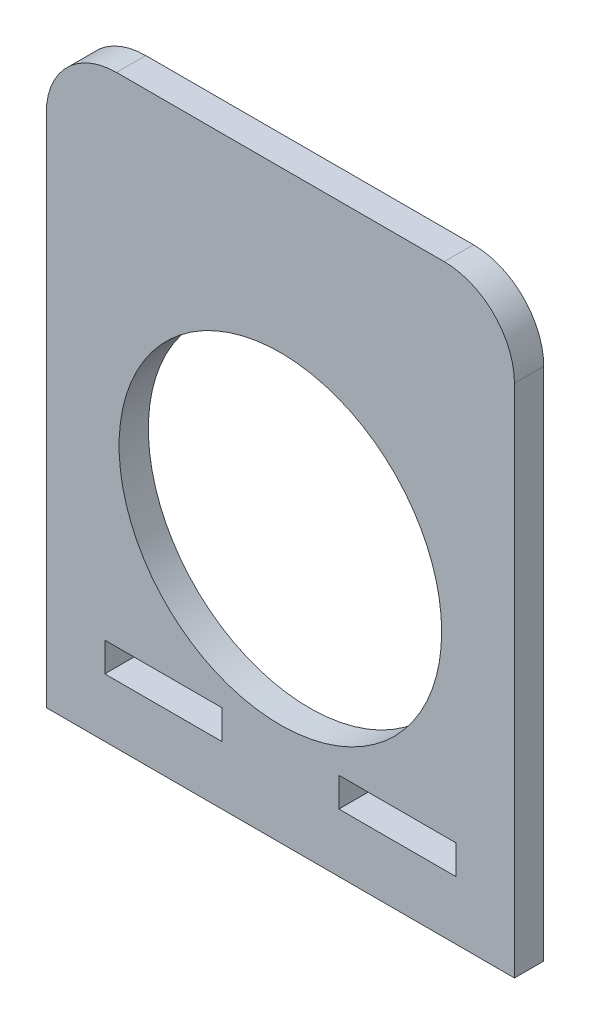
ISO-10303-21;
HEADER;
FILE_DESCRIPTION(('STEP AP214'),'2;1');
FILE_NAME('part.step','',(''),(''),'','','');
FILE_SCHEMA(('AUTOMOTIVE_DESIGN { 1 0 10303 214 1 1 1 1 }'));
ENDSEC;
DATA;
#1=APPLICATION_CONTEXT('core data for automotive mechanical design processes');
#2=APPLICATION_PROTOCOL_DEFINITION('international standard','automotive_design',2000,#1);
#3=PRODUCT_CONTEXT('',#1,'mechanical');
#4=PRODUCT('Part','Part','',(#3));
#5=PRODUCT_RELATED_PRODUCT_CATEGORY('part','',(#4));
#6=PRODUCT_DEFINITION_FORMATION('','',#4);
#7=PRODUCT_DEFINITION_CONTEXT('part definition',#1,'design');
#8=PRODUCT_DEFINITION('design','',#6,#7);
#9=PRODUCT_DEFINITION_SHAPE('','',#8);
#10=(LENGTH_UNIT() NAMED_UNIT(*) SI_UNIT(.MILLI.,.METRE.));
#11=(NAMED_UNIT(*) PLANE_ANGLE_UNIT() SI_UNIT($,.RADIAN.));
#12=(NAMED_UNIT(*) SI_UNIT($,.STERADIAN.) SOLID_ANGLE_UNIT());
#13=UNCERTAINTY_MEASURE_WITH_UNIT(LENGTH_MEASURE(1.E-05),#10,'distance_accuracy_value','');
#14=(GEOMETRIC_REPRESENTATION_CONTEXT(3) GLOBAL_UNCERTAINTY_ASSIGNED_CONTEXT((#13)) GLOBAL_UNIT_ASSIGNED_CONTEXT((#10,
#11,#12)) REPRESENTATION_CONTEXT('',''));
#15=CARTESIAN_POINT('',(0.,0.,0.));
#16=DIRECTION('',(0.,0.,1.));
#17=DIRECTION('',(1.,0.,0.));
#18=AXIS2_PLACEMENT_3D('',#15,#16,#17);
#19=CARTESIAN_POINT('',(43.18,55.88,3.175));
#20=DIRECTION('',(0.,0.,1.));
#21=DIRECTION('',(1.,0.,0.));
#22=AXIS2_PLACEMENT_3D('',#19,#20,#21);
#23=PLANE('',#22);
#24=DIRECTION('',(1.,0.,0.));
#25=VECTOR('',#24,1.);
#26=CARTESIAN_POINT('',(6.35,6.35,3.175));
#27=LINE('',#26,#25);
#28=CARTESIAN_POINT('',(6.35,6.35,3.175));
#29=VERTEX_POINT('',#28);
#30=CARTESIAN_POINT('',(19.05,6.35,3.175));
#31=VERTEX_POINT('',#30);
#32=EDGE_CURVE('E178',#29,#31,#27,.T.);
#33=ORIENTED_EDGE('',*,*,#32,.F.);
#34=DIRECTION('',(0.,-1.,0.));
#35=VECTOR('',#34,1.);
#36=CARTESIAN_POINT('',(6.35,6.35,3.175));
#37=LINE('',#36,#35);
#38=CARTESIAN_POINT('',(6.35,9.52499999999999,3.175));
#39=VERTEX_POINT('',#38);
#40=EDGE_CURVE('E176',#39,#29,#37,.T.);
#41=ORIENTED_EDGE('',*,*,#40,.F.);
#42=DIRECTION('',(-1.,0.,0.));
#43=VECTOR('',#42,1.);
#44=CARTESIAN_POINT('',(6.35,9.52499999999999,3.175));
#45=LINE('',#44,#43);
#46=CARTESIAN_POINT('',(19.05,9.525,3.175));
#47=VERTEX_POINT('',#46);
#48=EDGE_CURVE('E184',#47,#39,#45,.T.);
#49=ORIENTED_EDGE('',*,*,#48,.F.);
#50=DIRECTION('',(0.,1.,0.));
#51=VECTOR('',#50,1.);
#52=CARTESIAN_POINT('',(19.05,6.35,3.175));
#53=LINE('',#52,#51);
#54=EDGE_CURVE('E181',#31,#47,#53,.T.);
#55=ORIENTED_EDGE('',*,*,#54,.F.);
#56=EDGE_LOOP('',(#33,#41,#49,#55));
#57=FACE_BOUND('',#56,.T.);
#58=DIRECTION('',(0.,1.,0.));
#59=VECTOR('',#58,1.);
#60=CARTESIAN_POINT('',(50.8,0.,3.175));
#61=LINE('',#60,#59);
#62=CARTESIAN_POINT('',(50.8,0.,3.175));
#63=VERTEX_POINT('',#62);
#64=CARTESIAN_POINT('',(50.8,55.88,3.175));
#65=VERTEX_POINT('',#64);
#66=EDGE_CURVE('E207',#63,#65,#61,.T.);
#67=ORIENTED_EDGE('',*,*,#66,.T.);
#68=CARTESIAN_POINT('',(43.18,55.88,3.175));
#69=DIRECTION('',(0.,0.,1.));
#70=DIRECTION('',(1.,0.,0.));
#71=AXIS2_PLACEMENT_3D('',#68,#69,#70);
#72=CIRCLE('',#71,7.61999999999999);
#73=CARTESIAN_POINT('',(43.18,63.5,3.175));
#74=VERTEX_POINT('',#73);
#75=EDGE_CURVE('E210',#65,#74,#72,.T.);
#76=ORIENTED_EDGE('',*,*,#75,.T.);
#77=DIRECTION('',(-1.,0.,0.));
#78=VECTOR('',#77,1.);
#79=CARTESIAN_POINT('',(43.18,63.5,3.175));
#80=LINE('',#79,#78);
#81=CARTESIAN_POINT('',(7.62,63.5,3.175));
#82=VERTEX_POINT('',#81);
#83=EDGE_CURVE('E213',#74,#82,#80,.T.);
#84=ORIENTED_EDGE('',*,*,#83,.T.);
#85=CARTESIAN_POINT('',(7.62,55.88,3.175));
#86=DIRECTION('',(0.,0.,1.));
#87=DIRECTION('',(1.,0.,0.));
#88=AXIS2_PLACEMENT_3D('',#85,#86,#87);
#89=CIRCLE('',#88,7.62);
#90=CARTESIAN_POINT('',(0.,55.88,3.175));
#91=VERTEX_POINT('',#90);
#92=EDGE_CURVE('E215',#82,#91,#89,.T.);
#93=ORIENTED_EDGE('',*,*,#92,.T.);
#94=DIRECTION('',(0.,-1.,0.));
#95=VECTOR('',#94,1.);
#96=CARTESIAN_POINT('',(0.,55.88,3.175));
#97=LINE('',#96,#95);
#98=CARTESIAN_POINT('',(0.,0.,3.175));
#99=VERTEX_POINT('',#98);
#100=EDGE_CURVE('E217',#91,#99,#97,.T.);
#101=ORIENTED_EDGE('',*,*,#100,.T.);
#102=DIRECTION('',(1.,0.,0.));
#103=VECTOR('',#102,1.);
#104=CARTESIAN_POINT('',(0.,0.,3.175));
#105=LINE('',#104,#103);
#106=EDGE_CURVE('E219',#99,#63,#105,.T.);
#107=ORIENTED_EDGE('',*,*,#106,.T.);
#108=EDGE_LOOP('',(#67,#76,#84,#93,#101,#107));
#109=FACE_BOUND('',#108,.T.);
#110=CARTESIAN_POINT('',(25.4,28.575,3.175));
#111=DIRECTION('',(0.,0.,1.));
#112=DIRECTION('',(1.,0.,0.));
#113=AXIS2_PLACEMENT_3D('',#110,#111,#112);
#114=CIRCLE('',#113,17.5);
#115=CARTESIAN_POINT('',(42.9,28.575,3.175));
#116=VERTEX_POINT('',#115);
#117=EDGE_CURVE('E170',#116,#116,#114,.T.);
#118=ORIENTED_EDGE('',*,*,#117,.F.);
#119=EDGE_LOOP('',(#118));
#120=FACE_BOUND('',#119,.T.);
#121=DIRECTION('',(1.,0.,0.));
#122=VECTOR('',#121,1.);
#123=CARTESIAN_POINT('',(31.75,6.35,3.175));
#124=LINE('',#123,#122);
#125=CARTESIAN_POINT('',(31.75,6.35,3.175));
#126=VERTEX_POINT('',#125);
#127=CARTESIAN_POINT('',(44.45,6.35,3.175));
#128=VERTEX_POINT('',#127);
#129=EDGE_CURVE('E142',#126,#128,#124,.T.);
#130=ORIENTED_EDGE('',*,*,#129,.F.);
#131=DIRECTION('',(0.,-1.,0.));
#132=VECTOR('',#131,1.);
#133=CARTESIAN_POINT('',(31.75,6.35,3.175));
#134=LINE('',#133,#132);
#135=CARTESIAN_POINT('',(31.75,9.525,3.175));
#136=VERTEX_POINT('',#135);
#137=EDGE_CURVE('E134',#136,#126,#134,.T.);
#138=ORIENTED_EDGE('',*,*,#137,.F.);
#139=DIRECTION('',(-1.,0.,0.));
#140=VECTOR('',#139,1.);
#141=CARTESIAN_POINT('',(31.75,9.525,3.175));
#142=LINE('',#141,#140);
#143=CARTESIAN_POINT('',(44.45,9.525,3.175));
#144=VERTEX_POINT('',#143);
#145=EDGE_CURVE('E156',#144,#136,#142,.T.);
#146=ORIENTED_EDGE('',*,*,#145,.F.);
#147=DIRECTION('',(0.,1.,0.));
#148=VECTOR('',#147,1.);
#149=CARTESIAN_POINT('',(44.45,6.35,3.175));
#150=LINE('',#149,#148);
#151=EDGE_CURVE('E154',#128,#144,#150,.T.);
#152=ORIENTED_EDGE('',*,*,#151,.F.);
#153=EDGE_LOOP('',(#130,#138,#146,#152));
#154=FACE_BOUND('',#153,.T.);
#155=ADVANCED_FACE('F33',(#57,#109,#120,#154),#23,.T.);
#156=CARTESIAN_POINT('',(43.18,55.88,0.));
#157=DIRECTION('',(0.,0.,1.));
#158=DIRECTION('',(1.,0.,0.));
#159=AXIS2_PLACEMENT_3D('',#156,#157,#158);
#160=PLANE('',#159);
#161=CARTESIAN_POINT('',(25.4,28.575,0.));
#162=DIRECTION('',(0.,0.,1.));
#163=DIRECTION('',(1.,0.,0.));
#164=AXIS2_PLACEMENT_3D('',#161,#162,#163);
#165=CIRCLE('',#164,17.5);
#166=CARTESIAN_POINT('',(42.9,28.575,0.));
#167=VERTEX_POINT('',#166);
#168=EDGE_CURVE('E150',#167,#167,#165,.T.);
#169=ORIENTED_EDGE('',*,*,#168,.T.);
#170=EDGE_LOOP('',(#169));
#171=FACE_BOUND('',#170,.T.);
#172=DIRECTION('',(0.,-1.,0.));
#173=VECTOR('',#172,1.);
#174=CARTESIAN_POINT('',(6.35,6.35,0.));
#175=LINE('',#174,#173);
#176=CARTESIAN_POINT('',(6.35,9.52499999999999,0.));
#177=VERTEX_POINT('',#176);
#178=CARTESIAN_POINT('',(6.35,6.35,0.));
#179=VERTEX_POINT('',#178);
#180=EDGE_CURVE('E173',#177,#179,#175,.T.);
#181=ORIENTED_EDGE('',*,*,#180,.T.);
#182=DIRECTION('',(1.,0.,0.));
#183=VECTOR('',#182,1.);
#184=CARTESIAN_POINT('',(6.35,6.35,0.));
#185=LINE('',#184,#183);
#186=CARTESIAN_POINT('',(19.05,6.35,0.));
#187=VERTEX_POINT('',#186);
#188=EDGE_CURVE('E189',#179,#187,#185,.T.);
#189=ORIENTED_EDGE('',*,*,#188,.T.);
#190=DIRECTION('',(0.,1.,0.));
#191=VECTOR('',#190,1.);
#192=CARTESIAN_POINT('',(19.05,6.35,0.));
#193=LINE('',#192,#191);
#194=CARTESIAN_POINT('',(19.05,9.525,0.));
#195=VERTEX_POINT('',#194);
#196=EDGE_CURVE('E192',#187,#195,#193,.T.);
#197=ORIENTED_EDGE('',*,*,#196,.T.);
#198=DIRECTION('',(-1.,0.,0.));
#199=VECTOR('',#198,1.);
#200=CARTESIAN_POINT('',(6.35,9.52499999999999,0.));
#201=LINE('',#200,#199);
#202=EDGE_CURVE('E179',#195,#177,#201,.T.);
#203=ORIENTED_EDGE('',*,*,#202,.T.);
#204=EDGE_LOOP('',(#181,#189,#197,#203));
#205=FACE_BOUND('',#204,.T.);
#206=DIRECTION('',(0.,1.,0.));
#207=VECTOR('',#206,1.);
#208=CARTESIAN_POINT('',(50.8,0.,0.));
#209=LINE('',#208,#207);
#210=CARTESIAN_POINT('',(50.8,0.,0.));
#211=VERTEX_POINT('',#210);
#212=CARTESIAN_POINT('',(50.8,55.88,0.));
#213=VERTEX_POINT('',#212);
#214=EDGE_CURVE('E206',#211,#213,#209,.T.);
#215=ORIENTED_EDGE('',*,*,#214,.F.);
#216=DIRECTION('',(1.,0.,0.));
#217=VECTOR('',#216,1.);
#218=CARTESIAN_POINT('',(0.,0.,0.));
#219=LINE('',#218,#217);
#220=CARTESIAN_POINT('',(0.,0.,0.));
#221=VERTEX_POINT('',#220);
#222=EDGE_CURVE('E211',#221,#211,#219,.T.);
#223=ORIENTED_EDGE('',*,*,#222,.F.);
#224=DIRECTION('',(0.,-1.,0.));
#225=VECTOR('',#224,1.);
#226=CARTESIAN_POINT('',(0.,55.88,0.));
#227=LINE('',#226,#225);
#228=CARTESIAN_POINT('',(0.,55.88,0.));
#229=VERTEX_POINT('',#228);
#230=EDGE_CURVE('E230',#229,#221,#227,.T.);
#231=ORIENTED_EDGE('',*,*,#230,.F.);
#232=CARTESIAN_POINT('',(7.62,55.88,0.));
#233=DIRECTION('',(0.,0.,1.));
#234=DIRECTION('',(1.,0.,0.));
#235=AXIS2_PLACEMENT_3D('',#232,#233,#234);
#236=CIRCLE('',#235,7.62);
#237=CARTESIAN_POINT('',(7.62,63.5,0.));
#238=VERTEX_POINT('',#237);
#239=EDGE_CURVE('E228',#238,#229,#236,.T.);
#240=ORIENTED_EDGE('',*,*,#239,.F.);
#241=DIRECTION('',(-1.,0.,0.));
#242=VECTOR('',#241,1.);
#243=CARTESIAN_POINT('',(43.18,63.5,0.));
#244=LINE('',#243,#242);
#245=CARTESIAN_POINT('',(43.18,63.5,0.));
#246=VERTEX_POINT('',#245);
#247=EDGE_CURVE('E226',#246,#238,#244,.T.);
#248=ORIENTED_EDGE('',*,*,#247,.F.);
#249=CARTESIAN_POINT('',(43.18,55.88,0.));
#250=DIRECTION('',(0.,0.,1.));
#251=DIRECTION('',(1.,0.,0.));
#252=AXIS2_PLACEMENT_3D('',#249,#250,#251);
#253=CIRCLE('',#252,7.61999999999999);
#254=EDGE_CURVE('E224',#213,#246,#253,.T.);
#255=ORIENTED_EDGE('',*,*,#254,.F.);
#256=EDGE_LOOP('',(#215,#223,#231,#240,#248,#255));
#257=FACE_BOUND('',#256,.T.);
#258=DIRECTION('',(0.,-1.,0.));
#259=VECTOR('',#258,1.);
#260=CARTESIAN_POINT('',(31.75,6.35,0.));
#261=LINE('',#260,#259);
#262=CARTESIAN_POINT('',(31.75,9.525,0.));
#263=VERTEX_POINT('',#262);
#264=CARTESIAN_POINT('',(31.75,6.35,0.));
#265=VERTEX_POINT('',#264);
#266=EDGE_CURVE('E56',#263,#265,#261,.T.);
#267=ORIENTED_EDGE('',*,*,#266,.T.);
#268=DIRECTION('',(1.,0.,0.));
#269=VECTOR('',#268,1.);
#270=CARTESIAN_POINT('',(31.75,6.35,0.));
#271=LINE('',#270,#269);
#272=CARTESIAN_POINT('',(44.45,6.35,0.));
#273=VERTEX_POINT('',#272);
#274=EDGE_CURVE('E149',#265,#273,#271,.T.);
#275=ORIENTED_EDGE('',*,*,#274,.T.);
#276=DIRECTION('',(0.,1.,0.));
#277=VECTOR('',#276,1.);
#278=CARTESIAN_POINT('',(44.45,6.35,0.));
#279=LINE('',#278,#277);
#280=CARTESIAN_POINT('',(44.45,9.525,0.));
#281=VERTEX_POINT('',#280);
#282=EDGE_CURVE('E162',#273,#281,#279,.T.);
#283=ORIENTED_EDGE('',*,*,#282,.T.);
#284=DIRECTION('',(-1.,0.,0.));
#285=VECTOR('',#284,1.);
#286=CARTESIAN_POINT('',(31.75,9.525,0.));
#287=LINE('',#286,#285);
#288=EDGE_CURVE('E143',#281,#263,#287,.T.);
#289=ORIENTED_EDGE('',*,*,#288,.T.);
#290=EDGE_LOOP('',(#267,#275,#283,#289));
#291=FACE_BOUND('',#290,.T.);
#292=ADVANCED_FACE('F254',(#171,#205,#257,#291),#160,.F.);
#293=CARTESIAN_POINT('',(50.8,0.,3.175));
#294=DIRECTION('',(-1.,0.,0.));
#295=DIRECTION('',(0.,-1.,0.));
#296=AXIS2_PLACEMENT_3D('',#293,#294,#295);
#297=PLANE('',#296);
#298=ORIENTED_EDGE('',*,*,#214,.T.);
#299=DIRECTION('',(0.,0.,-1.));
#300=VECTOR('',#299,1.);
#301=CARTESIAN_POINT('',(50.8,55.88,3.175));
#302=LINE('',#301,#300);
#303=EDGE_CURVE('E11',#65,#213,#302,.T.);
#304=ORIENTED_EDGE('',*,*,#303,.F.);
#305=ORIENTED_EDGE('',*,*,#66,.F.);
#306=DIRECTION('',(0.,0.,-1.));
#307=VECTOR('',#306,1.);
#308=CARTESIAN_POINT('',(50.8,0.,3.175));
#309=LINE('',#308,#307);
#310=EDGE_CURVE('E221',#63,#211,#309,.T.);
#311=ORIENTED_EDGE('',*,*,#310,.T.);
#312=EDGE_LOOP('',(#298,#304,#305,#311));
#313=FACE_BOUND('',#312,.T.);
#314=ADVANCED_FACE('F35',(#313),#297,.F.);
#315=CARTESIAN_POINT('',(43.18,55.88,3.175));
#316=DIRECTION('',(0.,0.,-1.));
#317=DIRECTION('',(-1.,0.,0.));
#318=AXIS2_PLACEMENT_3D('',#315,#316,#317);
#319=CYLINDRICAL_SURFACE('',#318,7.61999999999999);
#320=ORIENTED_EDGE('',*,*,#254,.T.);
#321=DIRECTION('',(0.,0.,-1.));
#322=VECTOR('',#321,1.);
#323=CARTESIAN_POINT('',(43.18,63.5,3.175));
#324=LINE('',#323,#322);
#325=EDGE_CURVE('E41',#74,#246,#324,.T.);
#326=ORIENTED_EDGE('',*,*,#325,.F.);
#327=ORIENTED_EDGE('',*,*,#75,.F.);
#328=ORIENTED_EDGE('',*,*,#303,.T.);
#329=EDGE_LOOP('',(#320,#326,#327,#328));
#330=FACE_BOUND('',#329,.T.);
#331=ADVANCED_FACE('F272',(#330),#319,.T.);
#332=CARTESIAN_POINT('',(43.18,63.5,3.175));
#333=DIRECTION('',(0.,-1.,0.));
#334=DIRECTION('',(0.,0.,-1.));
#335=AXIS2_PLACEMENT_3D('',#332,#333,#334);
#336=PLANE('',#335);
#337=ORIENTED_EDGE('',*,*,#247,.T.);
#338=DIRECTION('',(0.,0.,-1.));
#339=VECTOR('',#338,1.);
#340=CARTESIAN_POINT('',(7.62,63.5,3.175));
#341=LINE('',#340,#339);
#342=EDGE_CURVE('E241',#82,#238,#341,.T.);
#343=ORIENTED_EDGE('',*,*,#342,.F.);
#344=ORIENTED_EDGE('',*,*,#83,.F.);
#345=ORIENTED_EDGE('',*,*,#325,.T.);
#346=EDGE_LOOP('',(#337,#343,#344,#345));
#347=FACE_BOUND('',#346,.T.);
#348=ADVANCED_FACE('F248',(#347),#336,.F.);
#349=CARTESIAN_POINT('',(7.62,55.88,3.175));
#350=DIRECTION('',(0.,0.,-1.));
#351=DIRECTION('',(-1.,0.,0.));
#352=AXIS2_PLACEMENT_3D('',#349,#350,#351);
#353=CYLINDRICAL_SURFACE('',#352,7.62);
#354=ORIENTED_EDGE('',*,*,#239,.T.);
#355=DIRECTION('',(0.,0.,-1.));
#356=VECTOR('',#355,1.);
#357=CARTESIAN_POINT('',(0.,55.88,3.175));
#358=LINE('',#357,#356);
#359=EDGE_CURVE('E238',#91,#229,#358,.T.);
#360=ORIENTED_EDGE('',*,*,#359,.F.);
#361=ORIENTED_EDGE('',*,*,#92,.F.);
#362=ORIENTED_EDGE('',*,*,#342,.T.);
#363=EDGE_LOOP('',(#354,#360,#361,#362));
#364=FACE_BOUND('',#363,.T.);
#365=ADVANCED_FACE('F260',(#364),#353,.T.);
#366=CARTESIAN_POINT('',(0.,55.88,3.175));
#367=DIRECTION('',(1.,0.,0.));
#368=DIRECTION('',(0.,1.,0.));
#369=AXIS2_PLACEMENT_3D('',#366,#367,#368);
#370=PLANE('',#369);
#371=ORIENTED_EDGE('',*,*,#230,.T.);
#372=DIRECTION('',(0.,0.,-1.));
#373=VECTOR('',#372,1.);
#374=CARTESIAN_POINT('',(0.,0.,3.175));
#375=LINE('',#374,#373);
#376=EDGE_CURVE('E235',#99,#221,#375,.T.);
#377=ORIENTED_EDGE('',*,*,#376,.F.);
#378=ORIENTED_EDGE('',*,*,#100,.F.);
#379=ORIENTED_EDGE('',*,*,#359,.T.);
#380=EDGE_LOOP('',(#371,#377,#378,#379));
#381=FACE_BOUND('',#380,.T.);
#382=ADVANCED_FACE('F264',(#381),#370,.F.);
#383=CARTESIAN_POINT('',(0.,0.,3.175));
#384=DIRECTION('',(0.,1.,0.));
#385=DIRECTION('',(-1.,0.,0.));
#386=AXIS2_PLACEMENT_3D('',#383,#384,#385);
#387=PLANE('',#386);
#388=ORIENTED_EDGE('',*,*,#222,.T.);
#389=ORIENTED_EDGE('',*,*,#310,.F.);
#390=ORIENTED_EDGE('',*,*,#106,.F.);
#391=ORIENTED_EDGE('',*,*,#376,.T.);
#392=EDGE_LOOP('',(#388,#389,#390,#391));
#393=FACE_BOUND('',#392,.T.);
#394=ADVANCED_FACE('F275',(#393),#387,.F.);
#395=CARTESIAN_POINT('',(6.35,6.35,3.175));
#396=DIRECTION('',(1.,0.,0.));
#397=DIRECTION('',(0.,0.,-1.));
#398=AXIS2_PLACEMENT_3D('',#395,#396,#397);
#399=PLANE('',#398);
#400=ORIENTED_EDGE('',*,*,#180,.F.);
#401=DIRECTION('',(0.,0.,-1.));
#402=VECTOR('',#401,1.);
#403=CARTESIAN_POINT('',(6.35,9.52499999999999,3.175));
#404=LINE('',#403,#402);
#405=EDGE_CURVE('E186',#39,#177,#404,.T.);
#406=ORIENTED_EDGE('',*,*,#405,.F.);
#407=ORIENTED_EDGE('',*,*,#40,.T.);
#408=DIRECTION('',(0.,0.,-1.));
#409=VECTOR('',#408,1.);
#410=CARTESIAN_POINT('',(6.35,6.35,3.175));
#411=LINE('',#410,#409);
#412=EDGE_CURVE('E203',#29,#179,#411,.T.);
#413=ORIENTED_EDGE('',*,*,#412,.T.);
#414=EDGE_LOOP('',(#400,#406,#407,#413));
#415=FACE_BOUND('',#414,.T.);
#416=ADVANCED_FACE('F277',(#415),#399,.T.);
#417=CARTESIAN_POINT('',(6.35,6.35,3.175));
#418=DIRECTION('',(0.,1.,0.));
#419=DIRECTION('',(0.,0.,1.));
#420=AXIS2_PLACEMENT_3D('',#417,#418,#419);
#421=PLANE('',#420);
#422=ORIENTED_EDGE('',*,*,#188,.F.);
#423=ORIENTED_EDGE('',*,*,#412,.F.);
#424=ORIENTED_EDGE('',*,*,#32,.T.);
#425=DIRECTION('',(0.,0.,-1.));
#426=VECTOR('',#425,1.);
#427=CARTESIAN_POINT('',(19.05,6.35,3.175));
#428=LINE('',#427,#426);
#429=EDGE_CURVE('E201',#31,#187,#428,.T.);
#430=ORIENTED_EDGE('',*,*,#429,.T.);
#431=EDGE_LOOP('',(#422,#423,#424,#430));
#432=FACE_BOUND('',#431,.T.);
#433=ADVANCED_FACE('F283',(#432),#421,.T.);
#434=CARTESIAN_POINT('',(19.05,6.35,3.175));
#435=DIRECTION('',(-1.,0.,0.));
#436=DIRECTION('',(0.,0.,1.));
#437=AXIS2_PLACEMENT_3D('',#434,#435,#436);
#438=PLANE('',#437);
#439=ORIENTED_EDGE('',*,*,#196,.F.);
#440=ORIENTED_EDGE('',*,*,#429,.F.);
#441=ORIENTED_EDGE('',*,*,#54,.T.);
#442=DIRECTION('',(0.,0.,-1.));
#443=VECTOR('',#442,1.);
#444=CARTESIAN_POINT('',(19.05,9.525,3.175));
#445=LINE('',#444,#443);
#446=EDGE_CURVE('E199',#47,#195,#445,.T.);
#447=ORIENTED_EDGE('',*,*,#446,.T.);
#448=EDGE_LOOP('',(#439,#440,#441,#447));
#449=FACE_BOUND('',#448,.T.);
#450=ADVANCED_FACE('F299',(#449),#438,.T.);
#451=CARTESIAN_POINT('',(6.35,9.52499999999999,3.175));
#452=DIRECTION('',(0.,-1.,0.));
#453=DIRECTION('',(1.,0.,0.));
#454=AXIS2_PLACEMENT_3D('',#451,#452,#453);
#455=PLANE('',#454);
#456=ORIENTED_EDGE('',*,*,#202,.F.);
#457=ORIENTED_EDGE('',*,*,#446,.F.);
#458=ORIENTED_EDGE('',*,*,#48,.T.);
#459=ORIENTED_EDGE('',*,*,#405,.T.);
#460=EDGE_LOOP('',(#456,#457,#458,#459));
#461=FACE_BOUND('',#460,.T.);
#462=ADVANCED_FACE('F303',(#461),#455,.T.);
#463=CARTESIAN_POINT('',(25.4,28.575,3.175));
#464=DIRECTION('',(0.,0.,-1.));
#465=DIRECTION('',(-1.,0.,0.));
#466=AXIS2_PLACEMENT_3D('',#463,#464,#465);
#467=CYLINDRICAL_SURFACE('',#466,17.5);
#468=ORIENTED_EDGE('',*,*,#117,.T.);
#469=EDGE_LOOP('',(#468));
#470=FACE_BOUND('',#469,.T.);
#471=ORIENTED_EDGE('',*,*,#168,.F.);
#472=EDGE_LOOP('',(#471));
#473=FACE_BOUND('',#472,.T.);
#474=ADVANCED_FACE('F307',(#470,#473),#467,.F.);
#475=CARTESIAN_POINT('',(31.75,6.35,3.175));
#476=DIRECTION('',(1.,0.,0.));
#477=DIRECTION('',(0.,0.,-1.));
#478=AXIS2_PLACEMENT_3D('',#475,#476,#477);
#479=PLANE('',#478);
#480=ORIENTED_EDGE('',*,*,#266,.F.);
#481=DIRECTION('',(0.,0.,-1.));
#482=VECTOR('',#481,1.);
#483=CARTESIAN_POINT('',(31.75,9.525,3.175));
#484=LINE('',#483,#482);
#485=EDGE_CURVE('E138',#136,#263,#484,.T.);
#486=ORIENTED_EDGE('',*,*,#485,.F.);
#487=ORIENTED_EDGE('',*,*,#137,.T.);
#488=DIRECTION('',(0.,0.,-1.));
#489=VECTOR('',#488,1.);
#490=CARTESIAN_POINT('',(31.75,6.35,3.175));
#491=LINE('',#490,#489);
#492=EDGE_CURVE('E137',#126,#265,#491,.T.);
#493=ORIENTED_EDGE('',*,*,#492,.T.);
#494=EDGE_LOOP('',(#480,#486,#487,#493));
#495=FACE_BOUND('',#494,.T.);
#496=ADVANCED_FACE('F136',(#495),#479,.T.);
#497=CARTESIAN_POINT('',(31.75,6.35,3.175));
#498=DIRECTION('',(0.,1.,0.));
#499=DIRECTION('',(-1.,0.,0.));
#500=AXIS2_PLACEMENT_3D('',#497,#498,#499);
#501=PLANE('',#500);
#502=ORIENTED_EDGE('',*,*,#274,.F.);
#503=ORIENTED_EDGE('',*,*,#492,.F.);
#504=ORIENTED_EDGE('',*,*,#129,.T.);
#505=DIRECTION('',(0.,0.,-1.));
#506=VECTOR('',#505,1.);
#507=CARTESIAN_POINT('',(44.45,6.35,3.175));
#508=LINE('',#507,#506);
#509=EDGE_CURVE('E151',#128,#273,#508,.T.);
#510=ORIENTED_EDGE('',*,*,#509,.T.);
#511=EDGE_LOOP('',(#502,#503,#504,#510));
#512=FACE_BOUND('',#511,.T.);
#513=ADVANCED_FACE('F146',(#512),#501,.T.);
#514=CARTESIAN_POINT('',(44.45,6.35,3.175));
#515=DIRECTION('',(-1.,0.,0.));
#516=DIRECTION('',(0.,0.,1.));
#517=AXIS2_PLACEMENT_3D('',#514,#515,#516);
#518=PLANE('',#517);
#519=ORIENTED_EDGE('',*,*,#282,.F.);
#520=ORIENTED_EDGE('',*,*,#509,.F.);
#521=ORIENTED_EDGE('',*,*,#151,.T.);
#522=DIRECTION('',(0.,0.,-1.));
#523=VECTOR('',#522,1.);
#524=CARTESIAN_POINT('',(44.45,9.525,3.175));
#525=LINE('',#524,#523);
#526=EDGE_CURVE('E48',#144,#281,#525,.T.);
#527=ORIENTED_EDGE('',*,*,#526,.T.);
#528=EDGE_LOOP('',(#519,#520,#521,#527));
#529=FACE_BOUND('',#528,.T.);
#530=ADVANCED_FACE('F316',(#529),#518,.T.);
#531=CARTESIAN_POINT('',(31.75,9.525,3.175));
#532=DIRECTION('',(0.,-1.,0.));
#533=DIRECTION('',(1.,0.,0.));
#534=AXIS2_PLACEMENT_3D('',#531,#532,#533);
#535=PLANE('',#534);
#536=ORIENTED_EDGE('',*,*,#288,.F.);
#537=ORIENTED_EDGE('',*,*,#526,.F.);
#538=ORIENTED_EDGE('',*,*,#145,.T.);
#539=ORIENTED_EDGE('',*,*,#485,.T.);
#540=EDGE_LOOP('',(#536,#537,#538,#539));
#541=FACE_BOUND('',#540,.T.);
#542=ADVANCED_FACE('F319',(#541),#535,.T.);
#543=CLOSED_SHELL('',(#155,#292,#314,#331,#348,#365,#382,#394,#416,#433,#450,#462,#474,#496,
#513,#530,#542));
#544=MANIFOLD_SOLID_BREP('B2',#543);
#545=ADVANCED_BREP_SHAPE_REPRESENTATION('',(#18,#544),#14);
#546=SHAPE_DEFINITION_REPRESENTATION(#9,#545);
ENDSEC;
END-ISO-10303-21;
